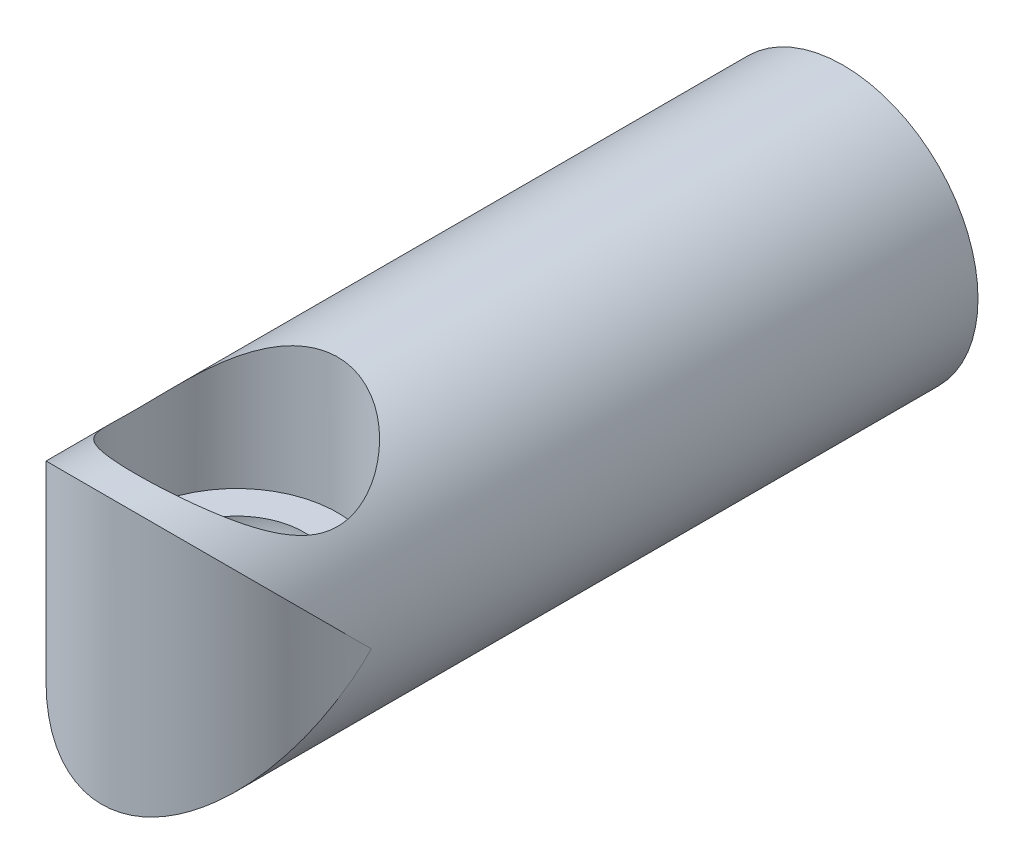
ISO-10303-21;
HEADER;
FILE_DESCRIPTION(('STEP AP214'),'2;1');
FILE_NAME('part.step','',(''),(''),'','','');
FILE_SCHEMA(('AUTOMOTIVE_DESIGN { 1 0 10303 214 1 1 1 1 }'));
ENDSEC;
DATA;
#1=APPLICATION_CONTEXT('core data for automotive mechanical design processes');
#2=APPLICATION_PROTOCOL_DEFINITION('international standard','automotive_design',2000,#1);
#3=PRODUCT_CONTEXT('',#1,'mechanical');
#4=PRODUCT('Part','Part','',(#3));
#5=PRODUCT_RELATED_PRODUCT_CATEGORY('part','',(#4));
#6=PRODUCT_DEFINITION_FORMATION('','',#4);
#7=PRODUCT_DEFINITION_CONTEXT('part definition',#1,'design');
#8=PRODUCT_DEFINITION('design','',#6,#7);
#9=PRODUCT_DEFINITION_SHAPE('','',#8);
#10=(LENGTH_UNIT() NAMED_UNIT(*) SI_UNIT(.MILLI.,.METRE.));
#11=(NAMED_UNIT(*) PLANE_ANGLE_UNIT() SI_UNIT($,.RADIAN.));
#12=(NAMED_UNIT(*) SI_UNIT($,.STERADIAN.) SOLID_ANGLE_UNIT());
#13=UNCERTAINTY_MEASURE_WITH_UNIT(LENGTH_MEASURE(1.E-05),#10,'distance_accuracy_value','');
#14=(GEOMETRIC_REPRESENTATION_CONTEXT(3) GLOBAL_UNCERTAINTY_ASSIGNED_CONTEXT((#13)) GLOBAL_UNIT_ASSIGNED_CONTEXT((#10,
#11,#12)) REPRESENTATION_CONTEXT('',''));
#15=CARTESIAN_POINT('',(0.,0.,0.));
#16=DIRECTION('',(0.,0.,1.));
#17=DIRECTION('',(1.,0.,0.));
#18=AXIS2_PLACEMENT_3D('',#15,#16,#17);
#19=CARTESIAN_POINT('',(0.,-2.56704379975048E-13,2.));
#20=DIRECTION('',(0.,0.,-1.));
#21=DIRECTION('',(-1.,0.,0.));
#22=AXIS2_PLACEMENT_3D('',#19,#20,#21);
#23=CYLINDRICAL_SURFACE('',#22,2.);
#24=CARTESIAN_POINT('',(0.,1.99999999999974,5.5));
#25=CARTESIAN_POINT('',(-0.0732207358411057,1.9999954019637,5.49999520798798));
#26=CARTESIAN_POINT('',(-0.146561062021436,1.99593645526249,5.49459497562551));
#27=CARTESIAN_POINT('',(-0.290936396286418,1.98006607281057,5.47333293658985));
#28=CARTESIAN_POINT('',(-0.361965136228955,1.96823514679828,5.45744482834996));
#29=CARTESIAN_POINT('',(-0.499234626631201,1.93795674956034,5.41628709071625));
#30=CARTESIAN_POINT('',(-0.565501615403689,1.91954951931984,5.39107448643085));
#31=CARTESIAN_POINT('',(-0.692422335520706,1.87750556721668,5.3324576558128));
#32=CARTESIAN_POINT('',(-0.753077701796286,1.85387037535458,5.29905582580651));
#33=CARTESIAN_POINT('',(-0.8734659375901,1.80049544543957,5.22173698840921));
#34=CARTESIAN_POINT('',(-0.932593229271988,1.77039308548414,5.17713267066596));
#35=CARTESIAN_POINT('',(-1.04302716767666,1.70767017883352,5.08050416263887));
#36=CARTESIAN_POINT('',(-1.09432148272222,1.67504578078583,5.02846851720021));
#37=CARTESIAN_POINT('',(-1.19837161436619,1.60271123651964,4.90641704672168));
#38=CARTESIAN_POINT('',(-1.24930578421201,1.56290854864612,4.83489632287835));
#39=CARTESIAN_POINT('',(-1.33861998176345,1.48711444664108,4.68254898763351));
#40=CARTESIAN_POINT('',(-1.37701716983074,1.45111786883648,4.60173530299975));
#41=CARTESIAN_POINT('',(-1.42880627811786,1.3997715518015,4.46049716132383));
#42=CARTESIAN_POINT('',(-1.44625674456537,1.38157751186705,4.40260930287169));
#43=CARTESIAN_POINT('',(-1.47420672564843,1.35171594150656,4.28360726521515));
#44=CARTESIAN_POINT('',(-1.48472215355266,1.34003347910802,4.22250082212528));
#45=CARTESIAN_POINT('',(-1.49812822141445,1.32503759684522,4.0978174144693));
#46=CARTESIAN_POINT('',(-1.50094954854207,1.32180026676566,4.03422319327602));
#47=CARTESIAN_POINT('',(-1.49848213241869,1.32459531776037,3.90738508911849));
#48=CARTESIAN_POINT('',(-1.4931904815735,1.33063102218081,3.84414133991263));
#49=CARTESIAN_POINT('',(-1.47597739291883,1.34967623262486,3.72680865257428));
#50=CARTESIAN_POINT('',(-1.46482486380818,1.36187157059839,3.67246362895388));
#51=CARTESIAN_POINT('',(-1.43705671120735,1.39114192844906,3.56656112127919));
#52=CARTESIAN_POINT('',(-1.42043583681175,1.40822163640736,3.51500637217648));
#53=CARTESIAN_POINT('',(-1.37033064172538,1.45741769294273,3.38374361336593));
#54=CARTESIAN_POINT('',(-1.33280148493984,1.49225649139199,3.30659958335657));
#55=CARTESIAN_POINT('',(-1.24618023314524,1.56533298145162,3.16080347613099));
#56=CARTESIAN_POINT('',(-1.19706004255884,1.60357878886076,3.09217266074542));
#57=CARTESIAN_POINT('',(-1.08651604102143,1.68051672313112,2.96224660959642));
#58=CARTESIAN_POINT('',(-1.02481375526044,1.71919586730206,2.90117939311859));
#59=CARTESIAN_POINT('',(-0.890422521709683,1.7924803798094,2.78973635321891));
#60=CARTESIAN_POINT('',(-0.817755054293857,1.82709348263728,2.73934007976969));
#61=CARTESIAN_POINT('',(-0.677902080454251,1.88279726073612,2.66001920075972));
#62=CARTESIAN_POINT('',(-0.612539870185729,1.90520770944978,2.62881540578427));
#63=CARTESIAN_POINT('',(-0.476352173202195,1.94372904416918,2.57577511953617));
#64=CARTESIAN_POINT('',(-0.405530141063874,1.95984387504323,2.55393276150075));
#65=CARTESIAN_POINT('',(-0.259676232483622,1.98445588635962,2.52074663711358));
#66=CARTESIAN_POINT('',(-0.184621281406044,1.99290592971722,2.50946782106138));
#67=CARTESIAN_POINT('',(-0.0332012397970115,2.00115883659419,2.4984504026283));
#68=CARTESIAN_POINT('',(0.0431632843726334,2.00096534845382,2.49870693130463));
#69=CARTESIAN_POINT('',(0.186804217329542,1.99242547175849,2.51011086927318));
#70=CARTESIAN_POINT('',(0.254222327546051,1.98490086600377,2.52016053688866));
#71=CARTESIAN_POINT('',(0.386110670609041,1.96351320201565,2.54897378000785));
#72=CARTESIAN_POINT('',(0.450580272987187,1.94964879507239,2.56773920968939));
#73=CARTESIAN_POINT('',(0.577416779689698,1.91599830683291,2.61388753059307));
#74=CARTESIAN_POINT('',(0.639629172536069,1.89602050290172,2.64155118142736));
#75=CARTESIAN_POINT('',(0.758518527043004,1.85166985411942,2.70417245542555));
#76=CARTESIAN_POINT('',(0.815194721336336,1.82729640132047,2.73913108763969));
#77=CARTESIAN_POINT('',(0.931511626318971,1.77119146886479,2.82178324641051));
#78=CARTESIAN_POINT('',(0.990066762698637,1.73891095025018,2.8706285394374));
#79=CARTESIAN_POINT('',(1.09871974855848,1.67238952874766,2.97600875258832));
#80=CARTESIAN_POINT('',(1.14879830469571,1.63814438507377,3.03256069969329));
#81=CARTESIAN_POINT('',(1.24877541075621,1.56369128291479,3.16414988096109));
#82=CARTESIAN_POINT('',(1.296830436487,1.52358718520083,3.24065756149221));
#83=CARTESIAN_POINT('',(1.37923235998278,1.44940591348434,3.40336007797235));
#84=CARTESIAN_POINT('',(1.41362000515515,1.41531099570952,3.48952512190846));
#85=CARTESIAN_POINT('',(1.45615734256764,1.37118877808565,3.63541444887436));
#86=CARTESIAN_POINT('',(1.46931009512993,1.35695811824547,3.69239112640227));
#87=CARTESIAN_POINT('',(1.48891522181905,1.33542056102992,3.80870704698308));
#88=CARTESIAN_POINT('',(1.49538255199239,1.32809821220214,3.86804070680215));
#89=CARTESIAN_POINT('',(1.50115320209064,1.32157601792188,3.98782907981124));
#90=CARTESIAN_POINT('',(1.50042015325262,1.32241740684955,4.04828794300949));
#91=CARTESIAN_POINT('',(1.4917688383822,1.33216448543645,4.16805683875208));
#92=CARTESIAN_POINT('',(1.48384130024586,1.34108058157462,4.22736528789719));
#93=CARTESIAN_POINT('',(1.45893841819724,1.3681734879775,4.35591457141074));
#94=CARTESIAN_POINT('',(1.44036567954113,1.38794705950621,4.42449718013271));
#95=CARTESIAN_POINT('',(1.39469627266121,1.43382963385386,4.55653484883042));
#96=CARTESIAN_POINT('',(1.36757807297733,1.45995460146906,4.61997644203812));
#97=CARTESIAN_POINT('',(1.29498918933646,1.52516477328799,4.76252063048627));
#98=CARTESIAN_POINT('',(1.24641542065975,1.56560203191079,4.83942158275569));
#99=CARTESIAN_POINT('',(1.13650718465942,1.64713510181247,4.9831260449775));
#100=CARTESIAN_POINT('',(1.07516134758583,1.68823146954196,5.04992046594478));
#101=CARTESIAN_POINT('',(0.939627144937964,1.76728988939766,5.17283184228327));
#102=CARTESIAN_POINT('',(0.865337161562939,1.80522333711045,5.22885631937714));
#103=CARTESIAN_POINT('',(0.705159098936294,1.87357289668069,5.3272230511453));
#104=CARTESIAN_POINT('',(0.619299420401891,1.90400691592931,5.36959797457246));
#105=CARTESIAN_POINT('',(0.464840290356558,1.94636704624021,5.42779942098567));
#106=CARTESIAN_POINT('',(0.398553614774838,1.96110322499691,5.44776673137615));
#107=CARTESIAN_POINT('',(0.262841610392866,1.98383739970211,5.47841790261147));
#108=CARTESIAN_POINT('',(0.193425623835012,1.99185421210868,5.48912769024995));
#109=CARTESIAN_POINT('',(0.102963309861985,1.99745471706283,5.49660469421434));
#110=CARTESIAN_POINT('',(0.0824069459942102,1.99840761432054,5.49787627748941));
#111=CARTESIAN_POINT('',(0.0412368896244457,1.99968095423113,5.49957467323097));
#112=CARTESIAN_POINT('',(0.0206231884284459,2.00000129507228,5.50000134970737));
#113=CARTESIAN_POINT('',(0.,1.99999999999974,5.5));
#114=B_SPLINE_CURVE_WITH_KNOTS('',3,(#24,#25,#26,#27,#28,#29,#30,#31,#32,#33,#34,#35,#36,#37,
#38,#39,#40,#41,#42,#43,#44,#45,#46,#47,#48,#49,#50,#51,#52,#53,#54,#55,#56,#57,#58,#59,#60,#61,
#62,#63,#64,#65,#66,#67,#68,#69,#70,#71,#72,#73,#74,#75,#76,#77,#78,#79,#80,#81,#82,#83,#84,#85,
#86,#87,#88,#89,#90,#91,#92,#93,#94,#95,#96,#97,#98,#99,#100,#101,#102,#103,#104,#105,#106,#107,
#108,#109,#110,#111,#112,#113),.UNSPECIFIED.,.T.,.F.,(4,2,2,2,2,2,2,2,2,2,2,2,2,2,2,2,2,2,2,2,2,
2,2,2,2,2,2,2,2,2,2,2,2,2,2,2,2,2,2,2,2,2,2,2,4),(0.,0.219571786572041,0.439696319423241,
0.658496333573377,0.877232398849287,1.11622431317429,1.35558868405161,1.6436001588745,
1.93121574056506,2.11999518529901,2.30833993195289,2.49837587621256,2.68847994300209,
2.85826890162708,3.02822137600638,3.30449331805907,3.58144192357885,3.86535883938086,
4.14872662493685,4.37526505006385,4.60166129643114,4.82944058166897,5.05712372466613,
5.26191187011994,5.46674360185812,5.67880439483679,5.8908945397754,6.13840382081865,
6.38646908985448,6.68168596015942,6.97601595850106,7.15589161422928,7.33536399114205,
7.51574333854739,7.69635548563854,7.91639670960133,8.13699685139919,8.43412246655765,
8.73151372390889,9.03135449492645,9.33047220273158,9.54195697541624,9.75284752283251,
9.81468166878708,9.87652576630966),.UNSPECIFIED.);
#115=CARTESIAN_POINT('',(0.,1.99999999999974,5.5));
#116=VERTEX_POINT('',#115);
#117=EDGE_CURVE('E12',#116,#116,#114,.T.);
#118=ORIENTED_EDGE('',*,*,#117,.T.);
#119=EDGE_LOOP('',(#118));
#120=FACE_BOUND('',#119,.T.);
#121=CARTESIAN_POINT('',(0.,-2.56704379975048E-13,-4.99999999999994));
#122=DIRECTION('',(0.,0.,1.));
#123=DIRECTION('',(1.,0.,0.));
#124=AXIS2_PLACEMENT_3D('',#121,#122,#123);
#125=CIRCLE('',#124,2.);
#126=CARTESIAN_POINT('',(2.00000000000005,-2.56704379975048E-13,-4.99999999999994));
#127=VERTEX_POINT('',#126);
#128=EDGE_CURVE('E56',#127,#127,#125,.T.);
#129=ORIENTED_EDGE('',*,*,#128,.T.);
#130=EDGE_LOOP('',(#129));
#131=FACE_BOUND('',#130,.T.);
#132=CARTESIAN_POINT('',(0.,-2.56721727209808E-13,4.));
#133=DIRECTION('',(0.,-0.707106781186547,0.707106781186547));
#134=DIRECTION('',(0.,-0.707106781186547,-0.707106781186547));
#135=AXIS2_PLACEMENT_3D('',#132,#133,#134);
#136=ELLIPSE('',#135,2.82842712474619,2.);
#137=CARTESIAN_POINT('',(2.00000000000005,0.,4.));
#138=VERTEX_POINT('',#137);
#139=CARTESIAN_POINT('',(-1.99999999999995,0.,4.));
#140=VERTEX_POINT('',#139);
#141=EDGE_CURVE('E66',#138,#140,#136,.T.);
#142=ORIENTED_EDGE('',*,*,#141,.F.);
#143=CARTESIAN_POINT('',(0.,-2.56721727209808E-13,4.));
#144=DIRECTION('',(0.,0.707106781186547,0.707106781186547));
#145=DIRECTION('',(0.,0.707106781186547,-0.707106781186547));
#146=AXIS2_PLACEMENT_3D('',#143,#144,#145);
#147=ELLIPSE('',#146,2.82842712474619,2.);
#148=EDGE_CURVE('E62',#138,#140,#147,.F.);
#149=ORIENTED_EDGE('',*,*,#148,.T.);
#150=EDGE_LOOP('',(#142,#149));
#151=FACE_BOUND('',#150,.T.);
#152=ADVANCED_FACE('F45',(#120,#131,#151),#23,.T.);
#153=CARTESIAN_POINT('',(0.,-2.56704379975048E-13,2.));
#154=DIRECTION('',(0.,0.,-1.));
#155=DIRECTION('',(-1.,0.,0.));
#156=AXIS2_PLACEMENT_3D('',#153,#154,#155);
#157=CYLINDRICAL_SURFACE('',#156,1.);
#158=CARTESIAN_POINT('',(0.,-2.56704379975048E-13,2.));
#159=DIRECTION('',(0.,0.,1.));
#160=DIRECTION('',(1.,0.,0.));
#161=AXIS2_PLACEMENT_3D('',#158,#159,#160);
#162=CIRCLE('',#161,1.);
#163=CARTESIAN_POINT('',(1.00000000000005,-2.56704379975048E-13,2.));
#164=VERTEX_POINT('',#163);
#165=EDGE_CURVE('E69',#164,#164,#162,.T.);
#166=ORIENTED_EDGE('',*,*,#165,.T.);
#167=EDGE_LOOP('',(#166));
#168=FACE_BOUND('',#167,.T.);
#169=CARTESIAN_POINT('',(0.,-2.56704379975048E-13,-4.99999999999994));
#170=DIRECTION('',(0.,0.,1.));
#171=DIRECTION('',(1.,0.,0.));
#172=AXIS2_PLACEMENT_3D('',#169,#170,#171);
#173=CIRCLE('',#172,1.);
#174=CARTESIAN_POINT('',(1.00000000000005,-2.56704379975048E-13,-4.99999999999994));
#175=VERTEX_POINT('',#174);
#176=EDGE_CURVE('E72',#175,#175,#173,.T.);
#177=ORIENTED_EDGE('',*,*,#176,.F.);
#178=EDGE_LOOP('',(#177));
#179=FACE_BOUND('',#178,.T.);
#180=ADVANCED_FACE('F100',(#168,#179),#157,.F.);
#181=CARTESIAN_POINT('',(0.,-2.56704379975048E-13,-4.99999999999994));
#182=DIRECTION('',(0.,0.,1.));
#183=DIRECTION('',(1.,0.,0.));
#184=AXIS2_PLACEMENT_3D('',#181,#182,#183);
#185=PLANE('',#184);
#186=ORIENTED_EDGE('',*,*,#176,.T.);
#187=EDGE_LOOP('',(#186));
#188=FACE_BOUND('',#187,.T.);
#189=ORIENTED_EDGE('',*,*,#128,.F.);
#190=EDGE_LOOP('',(#189));
#191=FACE_BOUND('',#190,.T.);
#192=ADVANCED_FACE('F105',(#188,#191),#185,.F.);
#193=CARTESIAN_POINT('',(-1.99999999999995,2.00099999999974,2.));
#194=DIRECTION('',(0.,0.,1.));
#195=DIRECTION('',(1.,0.,0.));
#196=AXIS2_PLACEMENT_3D('',#193,#194,#195);
#197=PLANE('',#196);
#198=ORIENTED_EDGE('',*,*,#165,.F.);
#199=EDGE_LOOP('',(#198));
#200=FACE_BOUND('',#199,.T.);
#201=ADVANCED_FACE('F112',(#200),#197,.F.);
#202=CARTESIAN_POINT('',(0.,2.00099999999974,4.));
#203=DIRECTION('',(0.,-1.,0.));
#204=DIRECTION('',(0.,0.,-1.));
#205=AXIS2_PLACEMENT_3D('',#202,#203,#204);
#206=CYLINDRICAL_SURFACE('',#205,2.);
#207=ORIENTED_EDGE('',*,*,#141,.T.);
#208=ORIENTED_EDGE('',*,*,#148,.F.);
#209=EDGE_LOOP('',(#207,#208));
#210=FACE_BOUND('',#209,.T.);
#211=ADVANCED_FACE('F65',(#210),#206,.T.);
#212=CARTESIAN_POINT('',(0.,-4.24264068711928,4.));
#213=DIRECTION('',(0.,1.,0.));
#214=DIRECTION('',(0.,0.,1.));
#215=AXIS2_PLACEMENT_3D('',#212,#213,#214);
#216=CYLINDRICAL_SURFACE('',#215,1.5);
#217=CARTESIAN_POINT('',(0.,0.,4.));
#218=DIRECTION('',(0.,1.,0.));
#219=DIRECTION('',(0.,0.,1.));
#220=AXIS2_PLACEMENT_3D('',#217,#218,#219);
#221=CIRCLE('',#220,1.5);
#222=CARTESIAN_POINT('',(0.,0.,5.5));
#223=VERTEX_POINT('',#222);
#224=EDGE_CURVE('E80',#223,#223,#221,.F.);
#225=ORIENTED_EDGE('',*,*,#224,.T.);
#226=EDGE_LOOP('',(#225));
#227=FACE_BOUND('',#226,.T.);
#228=ORIENTED_EDGE('',*,*,#117,.F.);
#229=EDGE_LOOP('',(#228));
#230=FACE_BOUND('',#229,.T.);
#231=ADVANCED_FACE('F86',(#227,#230),#216,.F.);
#232=CARTESIAN_POINT('',(0.,0.,0.));
#233=DIRECTION('',(0.,1.,0.));
#234=DIRECTION('',(0.,0.,1.));
#235=AXIS2_PLACEMENT_3D('',#232,#233,#234);
#236=PLANE('',#235);
#237=ORIENTED_EDGE('',*,*,#224,.F.);
#238=EDGE_LOOP('',(#237));
#239=FACE_BOUND('',#238,.T.);
#240=CARTESIAN_POINT('',(0.,0.,4.));
#241=DIRECTION('',(0.,1.,0.));
#242=DIRECTION('',(0.,0.,1.));
#243=AXIS2_PLACEMENT_3D('',#240,#241,#242);
#244=CIRCLE('',#243,1.);
#245=CARTESIAN_POINT('',(0.,0.,5.));
#246=VERTEX_POINT('',#245);
#247=EDGE_CURVE('E67',#246,#246,#244,.F.);
#248=ORIENTED_EDGE('',*,*,#247,.T.);
#249=EDGE_LOOP('',(#248));
#250=FACE_BOUND('',#249,.T.);
#251=ADVANCED_FACE('F89',(#239,#250),#236,.T.);
#252=CARTESIAN_POINT('',(0.,0.,4.));
#253=DIRECTION('',(0.,-1.,0.));
#254=DIRECTION('',(0.,0.,1.));
#255=AXIS2_PLACEMENT_3D('',#252,#253,#254);
#256=SPHERICAL_SURFACE('',#255,1.);
#257=ORIENTED_EDGE('',*,*,#247,.F.);
#258=EDGE_LOOP('',(#257));
#259=FACE_BOUND('',#258,.T.);
#260=ADVANCED_FACE('F91',(#259),#256,.F.);
#261=CLOSED_SHELL('',(#152,#180,#192,#201,#211,#231,#251,#260));
#262=MANIFOLD_SOLID_BREP('B2',#261);
#263=ADVANCED_BREP_SHAPE_REPRESENTATION('',(#18,#262),#14);
#264=SHAPE_DEFINITION_REPRESENTATION(#9,#263);
ENDSEC;
END-ISO-10303-21;
